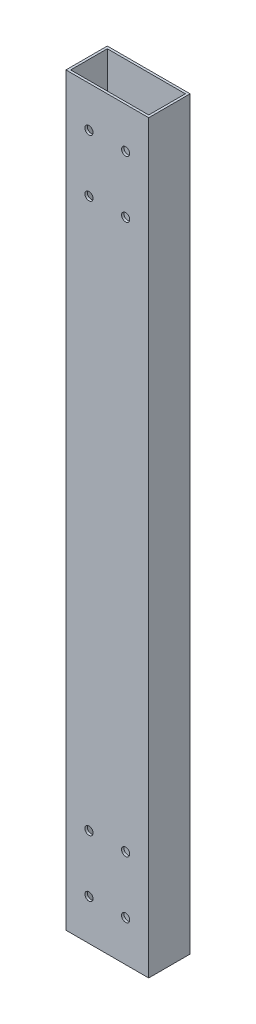
ISO-10303-21;
HEADER;
FILE_DESCRIPTION(('STEP AP214'),'2;1');
FILE_NAME('part.step','',(''),(''),'','','');
FILE_SCHEMA(('AUTOMOTIVE_DESIGN { 1 0 10303 214 1 1 1 1 }'));
ENDSEC;
DATA;
#1=APPLICATION_CONTEXT('core data for automotive mechanical design processes');
#2=APPLICATION_PROTOCOL_DEFINITION('international standard','automotive_design',2000,#1);
#3=PRODUCT_CONTEXT('',#1,'mechanical');
#4=PRODUCT('Part','Part','',(#3));
#5=PRODUCT_RELATED_PRODUCT_CATEGORY('part','',(#4));
#6=PRODUCT_DEFINITION_FORMATION('','',#4);
#7=PRODUCT_DEFINITION_CONTEXT('part definition',#1,'design');
#8=PRODUCT_DEFINITION('design','',#6,#7);
#9=PRODUCT_DEFINITION_SHAPE('','',#8);
#10=(LENGTH_UNIT() NAMED_UNIT(*) SI_UNIT(.MILLI.,.METRE.));
#11=(NAMED_UNIT(*) PLANE_ANGLE_UNIT() SI_UNIT($,.RADIAN.));
#12=(NAMED_UNIT(*) SI_UNIT($,.STERADIAN.) SOLID_ANGLE_UNIT());
#13=UNCERTAINTY_MEASURE_WITH_UNIT(LENGTH_MEASURE(1.E-05),#10,'distance_accuracy_value','');
#14=(GEOMETRIC_REPRESENTATION_CONTEXT(3) GLOBAL_UNCERTAINTY_ASSIGNED_CONTEXT((#13)) GLOBAL_UNIT_ASSIGNED_CONTEXT((#10,
#11,#12)) REPRESENTATION_CONTEXT('',''));
#15=CARTESIAN_POINT('',(0.,0.,0.));
#16=DIRECTION('',(0.,0.,1.));
#17=DIRECTION('',(1.,0.,0.));
#18=AXIS2_PLACEMENT_3D('',#15,#16,#17);
#19=CARTESIAN_POINT('',(0.,457.2,0.));
#20=DIRECTION('',(0.,-1.,0.));
#21=DIRECTION('',(0.,0.,-1.));
#22=AXIS2_PLACEMENT_3D('',#19,#20,#21);
#23=PLANE('',#22);
#24=DIRECTION('',(0.,0.,-1.));
#25=VECTOR('',#24,1.);
#26=CARTESIAN_POINT('',(25.4,457.2,12.7));
#27=LINE('',#26,#25);
#28=CARTESIAN_POINT('',(25.4,457.2,12.7));
#29=VERTEX_POINT('',#28);
#30=CARTESIAN_POINT('',(25.4,457.2,-12.7));
#31=VERTEX_POINT('',#30);
#32=EDGE_CURVE('E145',#29,#31,#27,.T.);
#33=ORIENTED_EDGE('',*,*,#32,.T.);
#34=DIRECTION('',(-1.,0.,0.));
#35=VECTOR('',#34,1.);
#36=CARTESIAN_POINT('',(-25.4,457.2,-12.7));
#37=LINE('',#36,#35);
#38=CARTESIAN_POINT('',(-25.4,457.2,-12.7));
#39=VERTEX_POINT('',#38);
#40=EDGE_CURVE('E150',#31,#39,#37,.T.);
#41=ORIENTED_EDGE('',*,*,#40,.T.);
#42=DIRECTION('',(0.,0.,1.));
#43=VECTOR('',#42,1.);
#44=CARTESIAN_POINT('',(-25.4,457.2,12.7));
#45=LINE('',#44,#43);
#46=CARTESIAN_POINT('',(-25.4,457.2,12.7));
#47=VERTEX_POINT('',#46);
#48=EDGE_CURVE('E147',#39,#47,#45,.T.);
#49=ORIENTED_EDGE('',*,*,#48,.T.);
#50=DIRECTION('',(1.,0.,0.));
#51=VECTOR('',#50,1.);
#52=CARTESIAN_POINT('',(-25.4,457.2,12.7));
#53=LINE('',#52,#51);
#54=EDGE_CURVE('E155',#47,#29,#53,.T.);
#55=ORIENTED_EDGE('',*,*,#54,.T.);
#56=EDGE_LOOP('',(#33,#41,#49,#55));
#57=FACE_BOUND('',#56,.T.);
#58=DIRECTION('',(0.,0.,1.));
#59=VECTOR('',#58,1.);
#60=CARTESIAN_POINT('',(-23.95,457.2,11.25));
#61=LINE('',#60,#59);
#62=CARTESIAN_POINT('',(-23.95,457.2,-11.25));
#63=VERTEX_POINT('',#62);
#64=CARTESIAN_POINT('',(-23.95,457.2,11.25));
#65=VERTEX_POINT('',#64);
#66=EDGE_CURVE('E106',#63,#65,#61,.T.);
#67=ORIENTED_EDGE('',*,*,#66,.F.);
#68=DIRECTION('',(-1.,0.,0.));
#69=VECTOR('',#68,1.);
#70=CARTESIAN_POINT('',(-23.95,457.2,-11.25));
#71=LINE('',#70,#69);
#72=CARTESIAN_POINT('',(23.95,457.2,-11.25));
#73=VERTEX_POINT('',#72);
#74=EDGE_CURVE('E126',#73,#63,#71,.T.);
#75=ORIENTED_EDGE('',*,*,#74,.F.);
#76=DIRECTION('',(0.,0.,-1.));
#77=VECTOR('',#76,1.);
#78=CARTESIAN_POINT('',(23.95,457.2,11.25));
#79=LINE('',#78,#77);
#80=CARTESIAN_POINT('',(23.95,457.2,11.25));
#81=VERTEX_POINT('',#80);
#82=EDGE_CURVE('E127',#81,#73,#79,.T.);
#83=ORIENTED_EDGE('',*,*,#82,.F.);
#84=DIRECTION('',(1.,0.,0.));
#85=VECTOR('',#84,1.);
#86=CARTESIAN_POINT('',(-23.95,457.2,11.25));
#87=LINE('',#86,#85);
#88=EDGE_CURVE('E111',#65,#81,#87,.T.);
#89=ORIENTED_EDGE('',*,*,#88,.F.);
#90=EDGE_LOOP('',(#67,#75,#83,#89));
#91=FACE_BOUND('',#90,.T.);
#92=ADVANCED_FACE('F39',(#57,#91),#23,.F.);
#93=CARTESIAN_POINT('',(0.,0.,0.));
#94=DIRECTION('',(0.,-1.,0.));
#95=DIRECTION('',(0.,0.,-1.));
#96=AXIS2_PLACEMENT_3D('',#93,#94,#95);
#97=PLANE('',#96);
#98=DIRECTION('',(0.,0.,-1.));
#99=VECTOR('',#98,1.);
#100=CARTESIAN_POINT('',(25.4,0.,12.7));
#101=LINE('',#100,#99);
#102=CARTESIAN_POINT('',(25.4,0.,12.7));
#103=VERTEX_POINT('',#102);
#104=CARTESIAN_POINT('',(25.4,0.,-12.7));
#105=VERTEX_POINT('',#104);
#106=EDGE_CURVE('E125',#103,#105,#101,.T.);
#107=ORIENTED_EDGE('',*,*,#106,.F.);
#108=DIRECTION('',(1.,0.,0.));
#109=VECTOR('',#108,1.);
#110=CARTESIAN_POINT('',(-25.4,0.,12.7));
#111=LINE('',#110,#109);
#112=CARTESIAN_POINT('',(-25.4,0.,12.7));
#113=VERTEX_POINT('',#112);
#114=EDGE_CURVE('E146',#113,#103,#111,.T.);
#115=ORIENTED_EDGE('',*,*,#114,.F.);
#116=DIRECTION('',(0.,0.,1.));
#117=VECTOR('',#116,1.);
#118=CARTESIAN_POINT('',(-25.4,0.,12.7));
#119=LINE('',#118,#117);
#120=CARTESIAN_POINT('',(-25.4,0.,-12.7));
#121=VERTEX_POINT('',#120);
#122=EDGE_CURVE('E157',#121,#113,#119,.T.);
#123=ORIENTED_EDGE('',*,*,#122,.F.);
#124=DIRECTION('',(-1.,0.,0.));
#125=VECTOR('',#124,1.);
#126=CARTESIAN_POINT('',(-25.4,0.,-12.7));
#127=LINE('',#126,#125);
#128=EDGE_CURVE('E160',#105,#121,#127,.T.);
#129=ORIENTED_EDGE('',*,*,#128,.F.);
#130=EDGE_LOOP('',(#107,#115,#123,#129));
#131=FACE_BOUND('',#130,.T.);
#132=DIRECTION('',(-1.,0.,0.));
#133=VECTOR('',#132,1.);
#134=CARTESIAN_POINT('',(-23.95,0.,-11.25));
#135=LINE('',#134,#133);
#136=CARTESIAN_POINT('',(23.95,0.,-11.25));
#137=VERTEX_POINT('',#136);
#138=CARTESIAN_POINT('',(-23.95,0.,-11.25));
#139=VERTEX_POINT('',#138);
#140=EDGE_CURVE('E113',#137,#139,#135,.T.);
#141=ORIENTED_EDGE('',*,*,#140,.T.);
#142=DIRECTION('',(0.,0.,1.));
#143=VECTOR('',#142,1.);
#144=CARTESIAN_POINT('',(-23.95,0.,11.25));
#145=LINE('',#144,#143);
#146=CARTESIAN_POINT('',(-23.95,0.,11.25));
#147=VERTEX_POINT('',#146);
#148=EDGE_CURVE('E64',#139,#147,#145,.T.);
#149=ORIENTED_EDGE('',*,*,#148,.T.);
#150=DIRECTION('',(1.,0.,0.));
#151=VECTOR('',#150,1.);
#152=CARTESIAN_POINT('',(-23.95,0.,11.25));
#153=LINE('',#152,#151);
#154=CARTESIAN_POINT('',(23.95,0.,11.25));
#155=VERTEX_POINT('',#154);
#156=EDGE_CURVE('E123',#147,#155,#153,.T.);
#157=ORIENTED_EDGE('',*,*,#156,.T.);
#158=DIRECTION('',(0.,0.,-1.));
#159=VECTOR('',#158,1.);
#160=CARTESIAN_POINT('',(23.95,0.,11.25));
#161=LINE('',#160,#159);
#162=EDGE_CURVE('E138',#155,#137,#161,.T.);
#163=ORIENTED_EDGE('',*,*,#162,.T.);
#164=EDGE_LOOP('',(#141,#149,#157,#163));
#165=FACE_BOUND('',#164,.T.);
#166=ADVANCED_FACE('F278',(#131,#165),#97,.T.);
#167=CARTESIAN_POINT('',(25.4,457.2,12.7));
#168=DIRECTION('',(-1.,0.,0.));
#169=DIRECTION('',(0.,0.,1.));
#170=AXIS2_PLACEMENT_3D('',#167,#168,#169);
#171=PLANE('',#170);
#172=ORIENTED_EDGE('',*,*,#106,.T.);
#173=DIRECTION('',(0.,-1.,0.));
#174=VECTOR('',#173,1.);
#175=CARTESIAN_POINT('',(25.4,457.2,-12.7));
#176=LINE('',#175,#174);
#177=EDGE_CURVE('E11',#31,#105,#176,.T.);
#178=ORIENTED_EDGE('',*,*,#177,.F.);
#179=ORIENTED_EDGE('',*,*,#32,.F.);
#180=DIRECTION('',(0.,-1.,0.));
#181=VECTOR('',#180,1.);
#182=CARTESIAN_POINT('',(25.4,457.2,12.7));
#183=LINE('',#182,#181);
#184=EDGE_CURVE('E152',#29,#103,#183,.T.);
#185=ORIENTED_EDGE('',*,*,#184,.T.);
#186=EDGE_LOOP('',(#172,#178,#179,#185));
#187=FACE_BOUND('',#186,.T.);
#188=ADVANCED_FACE('F41',(#187),#171,.F.);
#189=CARTESIAN_POINT('',(-25.4,457.2,-12.7));
#190=DIRECTION('',(0.,0.,1.));
#191=DIRECTION('',(1.,0.,0.));
#192=AXIS2_PLACEMENT_3D('',#189,#190,#191);
#193=PLANE('',#192);
#194=CARTESIAN_POINT('',(11.25,432.2,-12.7));
#195=DIRECTION('',(0.,0.,-1.));
#196=DIRECTION('',(1.,0.,0.));
#197=AXIS2_PLACEMENT_3D('',#194,#195,#196);
#198=CIRCLE('',#197,2.5);
#199=CARTESIAN_POINT('',(13.75,432.2,-12.7));
#200=VERTEX_POINT('',#199);
#201=EDGE_CURVE('E373',#200,#200,#198,.T.);
#202=ORIENTED_EDGE('',*,*,#201,.F.);
#203=EDGE_LOOP('',(#202));
#204=FACE_BOUND('',#203,.T.);
#205=CARTESIAN_POINT('',(-11.25,432.2,-12.7));
#206=DIRECTION('',(0.,0.,-1.));
#207=DIRECTION('',(1.,0.,0.));
#208=AXIS2_PLACEMENT_3D('',#205,#206,#207);
#209=CIRCLE('',#208,2.5);
#210=CARTESIAN_POINT('',(-8.75,432.2,-12.7));
#211=VERTEX_POINT('',#210);
#212=EDGE_CURVE('E362',#211,#211,#209,.T.);
#213=ORIENTED_EDGE('',*,*,#212,.F.);
#214=EDGE_LOOP('',(#213));
#215=FACE_BOUND('',#214,.T.);
#216=CARTESIAN_POINT('',(-11.25,397.2,-12.7));
#217=DIRECTION('',(0.,0.,-1.));
#218=DIRECTION('',(1.,0.,0.));
#219=AXIS2_PLACEMENT_3D('',#216,#217,#218);
#220=CIRCLE('',#219,2.5);
#221=CARTESIAN_POINT('',(-8.75,397.2,-12.7));
#222=VERTEX_POINT('',#221);
#223=EDGE_CURVE('E363',#222,#222,#220,.T.);
#224=ORIENTED_EDGE('',*,*,#223,.F.);
#225=EDGE_LOOP('',(#224));
#226=FACE_BOUND('',#225,.T.);
#227=CARTESIAN_POINT('',(11.25,397.2,-12.7));
#228=DIRECTION('',(0.,0.,-1.));
#229=DIRECTION('',(1.,0.,0.));
#230=AXIS2_PLACEMENT_3D('',#227,#228,#229);
#231=CIRCLE('',#230,2.5);
#232=CARTESIAN_POINT('',(13.75,397.2,-12.7));
#233=VERTEX_POINT('',#232);
#234=EDGE_CURVE('E189',#233,#233,#231,.T.);
#235=ORIENTED_EDGE('',*,*,#234,.F.);
#236=EDGE_LOOP('',(#235));
#237=FACE_BOUND('',#236,.T.);
#238=CARTESIAN_POINT('',(11.25,25.,-12.7));
#239=DIRECTION('',(0.,0.,1.));
#240=DIRECTION('',(1.,0.,0.));
#241=AXIS2_PLACEMENT_3D('',#238,#239,#240);
#242=CIRCLE('',#241,2.5);
#243=CARTESIAN_POINT('',(13.75,25.,-12.7));
#244=VERTEX_POINT('',#243);
#245=EDGE_CURVE('E209',#244,#244,#242,.T.);
#246=ORIENTED_EDGE('',*,*,#245,.T.);
#247=EDGE_LOOP('',(#246));
#248=FACE_BOUND('',#247,.T.);
#249=CARTESIAN_POINT('',(-11.25,25.,-12.7));
#250=DIRECTION('',(0.,0.,1.));
#251=DIRECTION('',(1.,0.,0.));
#252=AXIS2_PLACEMENT_3D('',#249,#250,#251);
#253=CIRCLE('',#252,2.5);
#254=CARTESIAN_POINT('',(-8.75,25.,-12.7));
#255=VERTEX_POINT('',#254);
#256=EDGE_CURVE('E222',#255,#255,#253,.T.);
#257=ORIENTED_EDGE('',*,*,#256,.T.);
#258=EDGE_LOOP('',(#257));
#259=FACE_BOUND('',#258,.T.);
#260=CARTESIAN_POINT('',(-11.25,60.,-12.7));
#261=DIRECTION('',(0.,0.,1.));
#262=DIRECTION('',(1.,0.,0.));
#263=AXIS2_PLACEMENT_3D('',#260,#261,#262);
#264=CIRCLE('',#263,2.5);
#265=CARTESIAN_POINT('',(-8.75,60.,-12.7));
#266=VERTEX_POINT('',#265);
#267=EDGE_CURVE('E214',#266,#266,#264,.T.);
#268=ORIENTED_EDGE('',*,*,#267,.T.);
#269=EDGE_LOOP('',(#268));
#270=FACE_BOUND('',#269,.T.);
#271=CARTESIAN_POINT('',(11.25,60.,-12.7));
#272=DIRECTION('',(0.,0.,1.));
#273=DIRECTION('',(1.,0.,0.));
#274=AXIS2_PLACEMENT_3D('',#271,#272,#273);
#275=CIRCLE('',#274,2.5);
#276=CARTESIAN_POINT('',(13.75,60.,-12.7));
#277=VERTEX_POINT('',#276);
#278=EDGE_CURVE('E173',#277,#277,#275,.T.);
#279=ORIENTED_EDGE('',*,*,#278,.T.);
#280=EDGE_LOOP('',(#279));
#281=FACE_BOUND('',#280,.T.);
#282=ORIENTED_EDGE('',*,*,#128,.T.);
#283=DIRECTION('',(0.,-1.,0.));
#284=VECTOR('',#283,1.);
#285=CARTESIAN_POINT('',(-25.4,457.2,-12.7));
#286=LINE('',#285,#284);
#287=EDGE_CURVE('E48',#39,#121,#286,.T.);
#288=ORIENTED_EDGE('',*,*,#287,.F.);
#289=ORIENTED_EDGE('',*,*,#40,.F.);
#290=ORIENTED_EDGE('',*,*,#177,.T.);
#291=EDGE_LOOP('',(#282,#288,#289,#290));
#292=FACE_BOUND('',#291,.T.);
#293=ADVANCED_FACE('F284',(#204,#215,#226,#237,#248,#259,#270,#281,#292),#193,.F.);
#294=CARTESIAN_POINT('',(-25.4,457.2,12.7));
#295=DIRECTION('',(1.,0.,0.));
#296=DIRECTION('',(0.,0.,-1.));
#297=AXIS2_PLACEMENT_3D('',#294,#295,#296);
#298=PLANE('',#297);
#299=ORIENTED_EDGE('',*,*,#122,.T.);
#300=DIRECTION('',(0.,-1.,0.));
#301=VECTOR('',#300,1.);
#302=CARTESIAN_POINT('',(-25.4,457.2,12.7));
#303=LINE('',#302,#301);
#304=EDGE_CURVE('E163',#47,#113,#303,.T.);
#305=ORIENTED_EDGE('',*,*,#304,.F.);
#306=ORIENTED_EDGE('',*,*,#48,.F.);
#307=ORIENTED_EDGE('',*,*,#287,.T.);
#308=EDGE_LOOP('',(#299,#305,#306,#307));
#309=FACE_BOUND('',#308,.T.);
#310=ADVANCED_FACE('F270',(#309),#298,.F.);
#311=CARTESIAN_POINT('',(-25.4,457.2,12.7));
#312=DIRECTION('',(0.,0.,-1.));
#313=DIRECTION('',(-1.,0.,0.));
#314=AXIS2_PLACEMENT_3D('',#311,#312,#313);
#315=PLANE('',#314);
#316=CARTESIAN_POINT('',(11.25,432.2,12.7));
#317=DIRECTION('',(0.,0.,-1.));
#318=DIRECTION('',(1.,0.,0.));
#319=AXIS2_PLACEMENT_3D('',#316,#317,#318);
#320=CIRCLE('',#319,2.5);
#321=CARTESIAN_POINT('',(13.75,432.2,12.7));
#322=VERTEX_POINT('',#321);
#323=EDGE_CURVE('E376',#322,#322,#320,.T.);
#324=ORIENTED_EDGE('',*,*,#323,.T.);
#325=EDGE_LOOP('',(#324));
#326=FACE_BOUND('',#325,.T.);
#327=CARTESIAN_POINT('',(-11.25,432.2,12.7));
#328=DIRECTION('',(0.,0.,-1.));
#329=DIRECTION('',(1.,0.,0.));
#330=AXIS2_PLACEMENT_3D('',#327,#328,#329);
#331=CIRCLE('',#330,2.5);
#332=CARTESIAN_POINT('',(-8.75,432.2,12.7));
#333=VERTEX_POINT('',#332);
#334=EDGE_CURVE('E366',#333,#333,#331,.T.);
#335=ORIENTED_EDGE('',*,*,#334,.T.);
#336=EDGE_LOOP('',(#335));
#337=FACE_BOUND('',#336,.T.);
#338=CARTESIAN_POINT('',(-11.25,397.2,12.7));
#339=DIRECTION('',(0.,0.,-1.));
#340=DIRECTION('',(1.,0.,0.));
#341=AXIS2_PLACEMENT_3D('',#338,#339,#340);
#342=CIRCLE('',#341,2.5);
#343=CARTESIAN_POINT('',(-8.75,397.2,12.7));
#344=VERTEX_POINT('',#343);
#345=EDGE_CURVE('E357',#344,#344,#342,.T.);
#346=ORIENTED_EDGE('',*,*,#345,.T.);
#347=EDGE_LOOP('',(#346));
#348=FACE_BOUND('',#347,.T.);
#349=CARTESIAN_POINT('',(11.25,397.2,12.7));
#350=DIRECTION('',(0.,0.,-1.));
#351=DIRECTION('',(1.,0.,0.));
#352=AXIS2_PLACEMENT_3D('',#349,#350,#351);
#353=CIRCLE('',#352,2.5);
#354=CARTESIAN_POINT('',(13.75,397.2,12.7));
#355=VERTEX_POINT('',#354);
#356=EDGE_CURVE('E364',#355,#355,#353,.T.);
#357=ORIENTED_EDGE('',*,*,#356,.T.);
#358=EDGE_LOOP('',(#357));
#359=FACE_BOUND('',#358,.T.);
#360=CARTESIAN_POINT('',(11.25,25.,12.7));
#361=DIRECTION('',(0.,0.,1.));
#362=DIRECTION('',(1.,0.,0.));
#363=AXIS2_PLACEMENT_3D('',#360,#361,#362);
#364=CIRCLE('',#363,2.5);
#365=CARTESIAN_POINT('',(13.75,25.,12.7));
#366=VERTEX_POINT('',#365);
#367=EDGE_CURVE('E221',#366,#366,#364,.T.);
#368=ORIENTED_EDGE('',*,*,#367,.F.);
#369=EDGE_LOOP('',(#368));
#370=FACE_BOUND('',#369,.T.);
#371=CARTESIAN_POINT('',(-11.25,25.,12.7));
#372=DIRECTION('',(0.,0.,1.));
#373=DIRECTION('',(1.,0.,0.));
#374=AXIS2_PLACEMENT_3D('',#371,#372,#373);
#375=CIRCLE('',#374,2.5);
#376=CARTESIAN_POINT('',(-8.75,25.,12.7));
#377=VERTEX_POINT('',#376);
#378=EDGE_CURVE('E217',#377,#377,#375,.T.);
#379=ORIENTED_EDGE('',*,*,#378,.F.);
#380=EDGE_LOOP('',(#379));
#381=FACE_BOUND('',#380,.T.);
#382=CARTESIAN_POINT('',(-11.25,60.,12.7));
#383=DIRECTION('',(0.,0.,1.));
#384=DIRECTION('',(1.,0.,0.));
#385=AXIS2_PLACEMENT_3D('',#382,#383,#384);
#386=CIRCLE('',#385,2.5);
#387=CARTESIAN_POINT('',(-8.75,60.,12.7));
#388=VERTEX_POINT('',#387);
#389=EDGE_CURVE('E211',#388,#388,#386,.T.);
#390=ORIENTED_EDGE('',*,*,#389,.F.);
#391=EDGE_LOOP('',(#390));
#392=FACE_BOUND('',#391,.T.);
#393=CARTESIAN_POINT('',(11.25,60.,12.7));
#394=DIRECTION('',(0.,0.,1.));
#395=DIRECTION('',(1.,0.,0.));
#396=AXIS2_PLACEMENT_3D('',#393,#394,#395);
#397=CIRCLE('',#396,2.5);
#398=CARTESIAN_POINT('',(13.75,60.,12.7));
#399=VERTEX_POINT('',#398);
#400=EDGE_CURVE('E212',#399,#399,#397,.T.);
#401=ORIENTED_EDGE('',*,*,#400,.F.);
#402=EDGE_LOOP('',(#401));
#403=FACE_BOUND('',#402,.T.);
#404=ORIENTED_EDGE('',*,*,#114,.T.);
#405=ORIENTED_EDGE('',*,*,#184,.F.);
#406=ORIENTED_EDGE('',*,*,#54,.F.);
#407=ORIENTED_EDGE('',*,*,#304,.T.);
#408=EDGE_LOOP('',(#404,#405,#406,#407));
#409=FACE_BOUND('',#408,.T.);
#410=ADVANCED_FACE('F262',(#326,#337,#348,#359,#370,#381,#392,#403,#409),#315,.F.);
#411=CARTESIAN_POINT('',(-23.95,457.2,11.25));
#412=DIRECTION('',(1.,0.,0.));
#413=DIRECTION('',(0.,0.,-1.));
#414=AXIS2_PLACEMENT_3D('',#411,#412,#413);
#415=PLANE('',#414);
#416=ORIENTED_EDGE('',*,*,#148,.F.);
#417=DIRECTION('',(0.,-1.,0.));
#418=VECTOR('',#417,1.);
#419=CARTESIAN_POINT('',(-23.95,457.2,-11.25));
#420=LINE('',#419,#418);
#421=EDGE_CURVE('E109',#63,#139,#420,.T.);
#422=ORIENTED_EDGE('',*,*,#421,.F.);
#423=ORIENTED_EDGE('',*,*,#66,.T.);
#424=DIRECTION('',(0.,-1.,0.));
#425=VECTOR('',#424,1.);
#426=CARTESIAN_POINT('',(-23.95,457.2,11.25));
#427=LINE('',#426,#425);
#428=EDGE_CURVE('E108',#65,#147,#427,.T.);
#429=ORIENTED_EDGE('',*,*,#428,.T.);
#430=EDGE_LOOP('',(#416,#422,#423,#429));
#431=FACE_BOUND('',#430,.T.);
#432=ADVANCED_FACE('F107',(#431),#415,.T.);
#433=CARTESIAN_POINT('',(-23.95,457.2,11.25));
#434=DIRECTION('',(0.,0.,-1.));
#435=DIRECTION('',(-1.,0.,0.));
#436=AXIS2_PLACEMENT_3D('',#433,#434,#435);
#437=PLANE('',#436);
#438=CARTESIAN_POINT('',(11.25,432.2,11.25));
#439=DIRECTION('',(0.,0.,-1.));
#440=DIRECTION('',(-1.,0.,0.));
#441=AXIS2_PLACEMENT_3D('',#438,#439,#440);
#442=CIRCLE('',#441,2.5);
#443=CARTESIAN_POINT('',(8.75,432.2,11.25));
#444=VERTEX_POINT('',#443);
#445=EDGE_CURVE('E210',#444,#444,#442,.F.);
#446=ORIENTED_EDGE('',*,*,#445,.T.);
#447=EDGE_LOOP('',(#446));
#448=FACE_BOUND('',#447,.T.);
#449=CARTESIAN_POINT('',(-11.25,432.2,11.25));
#450=DIRECTION('',(0.,0.,-1.));
#451=DIRECTION('',(-1.,0.,0.));
#452=AXIS2_PLACEMENT_3D('',#449,#450,#451);
#453=CIRCLE('',#452,2.5);
#454=CARTESIAN_POINT('',(-13.75,432.2,11.25));
#455=VERTEX_POINT('',#454);
#456=EDGE_CURVE('E194',#455,#455,#453,.F.);
#457=ORIENTED_EDGE('',*,*,#456,.T.);
#458=EDGE_LOOP('',(#457));
#459=FACE_BOUND('',#458,.T.);
#460=CARTESIAN_POINT('',(-11.25,397.2,11.25));
#461=DIRECTION('',(0.,0.,-1.));
#462=DIRECTION('',(-1.,0.,0.));
#463=AXIS2_PLACEMENT_3D('',#460,#461,#462);
#464=CIRCLE('',#463,2.5);
#465=CARTESIAN_POINT('',(-13.75,397.2,11.25));
#466=VERTEX_POINT('',#465);
#467=EDGE_CURVE('E195',#466,#466,#464,.F.);
#468=ORIENTED_EDGE('',*,*,#467,.T.);
#469=EDGE_LOOP('',(#468));
#470=FACE_BOUND('',#469,.T.);
#471=CARTESIAN_POINT('',(11.25,397.2,11.25));
#472=DIRECTION('',(0.,0.,-1.));
#473=DIRECTION('',(-1.,0.,0.));
#474=AXIS2_PLACEMENT_3D('',#471,#472,#473);
#475=CIRCLE('',#474,2.5);
#476=CARTESIAN_POINT('',(8.75,397.2,11.25));
#477=VERTEX_POINT('',#476);
#478=EDGE_CURVE('E188',#477,#477,#475,.F.);
#479=ORIENTED_EDGE('',*,*,#478,.T.);
#480=EDGE_LOOP('',(#479));
#481=FACE_BOUND('',#480,.T.);
#482=CARTESIAN_POINT('',(11.25,25.,11.25));
#483=DIRECTION('',(0.,0.,-1.));
#484=DIRECTION('',(-1.,0.,0.));
#485=AXIS2_PLACEMENT_3D('',#482,#483,#484);
#486=CIRCLE('',#485,2.5);
#487=CARTESIAN_POINT('',(8.75,25.,11.25));
#488=VERTEX_POINT('',#487);
#489=EDGE_CURVE('E134',#488,#488,#486,.T.);
#490=ORIENTED_EDGE('',*,*,#489,.F.);
#491=EDGE_LOOP('',(#490));
#492=FACE_BOUND('',#491,.T.);
#493=CARTESIAN_POINT('',(-11.25,25.,11.25));
#494=DIRECTION('',(0.,0.,-1.));
#495=DIRECTION('',(-1.,0.,0.));
#496=AXIS2_PLACEMENT_3D('',#493,#494,#495);
#497=CIRCLE('',#496,2.5);
#498=CARTESIAN_POINT('',(-13.75,25.,11.25));
#499=VERTEX_POINT('',#498);
#500=EDGE_CURVE('E182',#499,#499,#497,.T.);
#501=ORIENTED_EDGE('',*,*,#500,.F.);
#502=EDGE_LOOP('',(#501));
#503=FACE_BOUND('',#502,.T.);
#504=CARTESIAN_POINT('',(-11.25,60.,11.25));
#505=DIRECTION('',(0.,0.,-1.));
#506=DIRECTION('',(-1.,0.,0.));
#507=AXIS2_PLACEMENT_3D('',#504,#505,#506);
#508=CIRCLE('',#507,2.5);
#509=CARTESIAN_POINT('',(-13.75,60.,11.25));
#510=VERTEX_POINT('',#509);
#511=EDGE_CURVE('E180',#510,#510,#508,.T.);
#512=ORIENTED_EDGE('',*,*,#511,.F.);
#513=EDGE_LOOP('',(#512));
#514=FACE_BOUND('',#513,.T.);
#515=CARTESIAN_POINT('',(11.25,60.,11.25));
#516=DIRECTION('',(0.,0.,-1.));
#517=DIRECTION('',(-1.,0.,0.));
#518=AXIS2_PLACEMENT_3D('',#515,#516,#517);
#519=CIRCLE('',#518,2.5);
#520=CARTESIAN_POINT('',(8.75,60.,11.25));
#521=VERTEX_POINT('',#520);
#522=EDGE_CURVE('E175',#521,#521,#519,.T.);
#523=ORIENTED_EDGE('',*,*,#522,.F.);
#524=EDGE_LOOP('',(#523));
#525=FACE_BOUND('',#524,.T.);
#526=ORIENTED_EDGE('',*,*,#156,.F.);
#527=ORIENTED_EDGE('',*,*,#428,.F.);
#528=ORIENTED_EDGE('',*,*,#88,.T.);
#529=DIRECTION('',(0.,-1.,0.));
#530=VECTOR('',#529,1.);
#531=CARTESIAN_POINT('',(23.95,457.2,11.25));
#532=LINE('',#531,#530);
#533=EDGE_CURVE('E121',#81,#155,#532,.T.);
#534=ORIENTED_EDGE('',*,*,#533,.T.);
#535=EDGE_LOOP('',(#526,#527,#528,#534));
#536=FACE_BOUND('',#535,.T.);
#537=ADVANCED_FACE('F118',(#448,#459,#470,#481,#492,#503,#514,#525,#536),#437,.T.);
#538=CARTESIAN_POINT('',(23.95,457.2,11.25));
#539=DIRECTION('',(-1.,0.,0.));
#540=DIRECTION('',(0.,0.,1.));
#541=AXIS2_PLACEMENT_3D('',#538,#539,#540);
#542=PLANE('',#541);
#543=ORIENTED_EDGE('',*,*,#162,.F.);
#544=ORIENTED_EDGE('',*,*,#533,.F.);
#545=ORIENTED_EDGE('',*,*,#82,.T.);
#546=DIRECTION('',(0.,-1.,0.));
#547=VECTOR('',#546,1.);
#548=CARTESIAN_POINT('',(23.95,457.2,-11.25));
#549=LINE('',#548,#547);
#550=EDGE_CURVE('E57',#73,#137,#549,.T.);
#551=ORIENTED_EDGE('',*,*,#550,.T.);
#552=EDGE_LOOP('',(#543,#544,#545,#551));
#553=FACE_BOUND('',#552,.T.);
#554=ADVANCED_FACE('F248',(#553),#542,.T.);
#555=CARTESIAN_POINT('',(-23.95,457.2,-11.25));
#556=DIRECTION('',(0.,0.,1.));
#557=DIRECTION('',(1.,0.,0.));
#558=AXIS2_PLACEMENT_3D('',#555,#556,#557);
#559=PLANE('',#558);
#560=CARTESIAN_POINT('',(11.25,432.2,-11.25));
#561=DIRECTION('',(0.,0.,1.));
#562=DIRECTION('',(1.,0.,0.));
#563=AXIS2_PLACEMENT_3D('',#560,#561,#562);
#564=CIRCLE('',#563,2.5);
#565=CARTESIAN_POINT('',(13.75,432.2,-11.25));
#566=VERTEX_POINT('',#565);
#567=EDGE_CURVE('E43',#566,#566,#564,.F.);
#568=ORIENTED_EDGE('',*,*,#567,.T.);
#569=EDGE_LOOP('',(#568));
#570=FACE_BOUND('',#569,.T.);
#571=CARTESIAN_POINT('',(-11.25,432.2,-11.25));
#572=DIRECTION('',(0.,0.,1.));
#573=DIRECTION('',(1.,0.,0.));
#574=AXIS2_PLACEMENT_3D('',#571,#572,#573);
#575=CIRCLE('',#574,2.5);
#576=CARTESIAN_POINT('',(-8.75,432.2,-11.25));
#577=VERTEX_POINT('',#576);
#578=EDGE_CURVE('E191',#577,#577,#575,.F.);
#579=ORIENTED_EDGE('',*,*,#578,.T.);
#580=EDGE_LOOP('',(#579));
#581=FACE_BOUND('',#580,.T.);
#582=CARTESIAN_POINT('',(-11.25,397.2,-11.25));
#583=DIRECTION('',(0.,0.,1.));
#584=DIRECTION('',(1.,0.,0.));
#585=AXIS2_PLACEMENT_3D('',#582,#583,#584);
#586=CIRCLE('',#585,2.5);
#587=CARTESIAN_POINT('',(-8.75,397.2,-11.25));
#588=VERTEX_POINT('',#587);
#589=EDGE_CURVE('E186',#588,#588,#586,.F.);
#590=ORIENTED_EDGE('',*,*,#589,.T.);
#591=EDGE_LOOP('',(#590));
#592=FACE_BOUND('',#591,.T.);
#593=CARTESIAN_POINT('',(11.25,397.2,-11.25));
#594=DIRECTION('',(0.,0.,1.));
#595=DIRECTION('',(1.,0.,0.));
#596=AXIS2_PLACEMENT_3D('',#593,#594,#595);
#597=CIRCLE('',#596,2.5);
#598=CARTESIAN_POINT('',(13.75,397.2,-11.25));
#599=VERTEX_POINT('',#598);
#600=EDGE_CURVE('E183',#599,#599,#597,.F.);
#601=ORIENTED_EDGE('',*,*,#600,.T.);
#602=EDGE_LOOP('',(#601));
#603=FACE_BOUND('',#602,.T.);
#604=CARTESIAN_POINT('',(11.25,25.,-11.25));
#605=DIRECTION('',(0.,0.,1.));
#606=DIRECTION('',(1.,0.,0.));
#607=AXIS2_PLACEMENT_3D('',#604,#605,#606);
#608=CIRCLE('',#607,2.5);
#609=CARTESIAN_POINT('',(13.75,25.,-11.25));
#610=VERTEX_POINT('',#609);
#611=EDGE_CURVE('E185',#610,#610,#608,.T.);
#612=ORIENTED_EDGE('',*,*,#611,.F.);
#613=EDGE_LOOP('',(#612));
#614=FACE_BOUND('',#613,.T.);
#615=CARTESIAN_POINT('',(-11.25,25.,-11.25));
#616=DIRECTION('',(0.,0.,1.));
#617=DIRECTION('',(1.,0.,0.));
#618=AXIS2_PLACEMENT_3D('',#615,#616,#617);
#619=CIRCLE('',#618,2.5);
#620=CARTESIAN_POINT('',(-8.75,25.,-11.25));
#621=VERTEX_POINT('',#620);
#622=EDGE_CURVE('E176',#621,#621,#619,.T.);
#623=ORIENTED_EDGE('',*,*,#622,.F.);
#624=EDGE_LOOP('',(#623));
#625=FACE_BOUND('',#624,.T.);
#626=CARTESIAN_POINT('',(-11.25,60.,-11.25));
#627=DIRECTION('',(0.,0.,1.));
#628=DIRECTION('',(1.,0.,0.));
#629=AXIS2_PLACEMENT_3D('',#626,#627,#628);
#630=CIRCLE('',#629,2.5);
#631=CARTESIAN_POINT('',(-8.75,60.,-11.25));
#632=VERTEX_POINT('',#631);
#633=EDGE_CURVE('E174',#632,#632,#630,.T.);
#634=ORIENTED_EDGE('',*,*,#633,.F.);
#635=EDGE_LOOP('',(#634));
#636=FACE_BOUND('',#635,.T.);
#637=CARTESIAN_POINT('',(11.25,60.,-11.25));
#638=DIRECTION('',(0.,0.,1.));
#639=DIRECTION('',(1.,0.,0.));
#640=AXIS2_PLACEMENT_3D('',#637,#638,#639);
#641=CIRCLE('',#640,2.5);
#642=CARTESIAN_POINT('',(13.75,60.,-11.25));
#643=VERTEX_POINT('',#642);
#644=EDGE_CURVE('E166',#643,#643,#641,.T.);
#645=ORIENTED_EDGE('',*,*,#644,.F.);
#646=EDGE_LOOP('',(#645));
#647=FACE_BOUND('',#646,.T.);
#648=ORIENTED_EDGE('',*,*,#140,.F.);
#649=ORIENTED_EDGE('',*,*,#550,.F.);
#650=ORIENTED_EDGE('',*,*,#74,.T.);
#651=ORIENTED_EDGE('',*,*,#421,.T.);
#652=EDGE_LOOP('',(#648,#649,#650,#651));
#653=FACE_BOUND('',#652,.T.);
#654=ADVANCED_FACE('F308',(#570,#581,#592,#603,#614,#625,#636,#647,#653),#559,.T.);
#655=CARTESIAN_POINT('',(11.25,60.,-12.7));
#656=DIRECTION('',(0.,0.,1.));
#657=DIRECTION('',(1.,0.,0.));
#658=AXIS2_PLACEMENT_3D('',#655,#656,#657);
#659=CYLINDRICAL_SURFACE('',#658,2.5);
#660=ORIENTED_EDGE('',*,*,#644,.T.);
#661=EDGE_LOOP('',(#660));
#662=FACE_BOUND('',#661,.T.);
#663=ORIENTED_EDGE('',*,*,#278,.F.);
#664=EDGE_LOOP('',(#663));
#665=FACE_BOUND('',#664,.T.);
#666=ADVANCED_FACE('F261',(#662,#665),#659,.F.);
#667=CARTESIAN_POINT('',(-11.25,60.,-12.7));
#668=DIRECTION('',(0.,0.,1.));
#669=DIRECTION('',(1.,0.,0.));
#670=AXIS2_PLACEMENT_3D('',#667,#668,#669);
#671=CYLINDRICAL_SURFACE('',#670,2.5);
#672=ORIENTED_EDGE('',*,*,#633,.T.);
#673=EDGE_LOOP('',(#672));
#674=FACE_BOUND('',#673,.T.);
#675=ORIENTED_EDGE('',*,*,#267,.F.);
#676=EDGE_LOOP('',(#675));
#677=FACE_BOUND('',#676,.T.);
#678=ADVANCED_FACE('F315',(#674,#677),#671,.F.);
#679=CARTESIAN_POINT('',(-11.25,25.,-12.7));
#680=DIRECTION('',(0.,0.,1.));
#681=DIRECTION('',(1.,0.,0.));
#682=AXIS2_PLACEMENT_3D('',#679,#680,#681);
#683=CYLINDRICAL_SURFACE('',#682,2.5);
#684=ORIENTED_EDGE('',*,*,#622,.T.);
#685=EDGE_LOOP('',(#684));
#686=FACE_BOUND('',#685,.T.);
#687=ORIENTED_EDGE('',*,*,#256,.F.);
#688=EDGE_LOOP('',(#687));
#689=FACE_BOUND('',#688,.T.);
#690=ADVANCED_FACE('F316',(#686,#689),#683,.F.);
#691=CARTESIAN_POINT('',(11.25,25.,-12.7));
#692=DIRECTION('',(0.,0.,1.));
#693=DIRECTION('',(1.,0.,0.));
#694=AXIS2_PLACEMENT_3D('',#691,#692,#693);
#695=CYLINDRICAL_SURFACE('',#694,2.5);
#696=ORIENTED_EDGE('',*,*,#611,.T.);
#697=EDGE_LOOP('',(#696));
#698=FACE_BOUND('',#697,.T.);
#699=ORIENTED_EDGE('',*,*,#245,.F.);
#700=EDGE_LOOP('',(#699));
#701=FACE_BOUND('',#700,.T.);
#702=ADVANCED_FACE('F259',(#698,#701),#695,.F.);
#703=ORIENTED_EDGE('',*,*,#522,.T.);
#704=EDGE_LOOP('',(#703));
#705=FACE_BOUND('',#704,.T.);
#706=ORIENTED_EDGE('',*,*,#400,.T.);
#707=EDGE_LOOP('',(#706));
#708=FACE_BOUND('',#707,.T.);
#709=ADVANCED_FACE('F254',(#705,#708),#659,.F.);
#710=ORIENTED_EDGE('',*,*,#511,.T.);
#711=EDGE_LOOP('',(#710));
#712=FACE_BOUND('',#711,.T.);
#713=ORIENTED_EDGE('',*,*,#389,.T.);
#714=EDGE_LOOP('',(#713));
#715=FACE_BOUND('',#714,.T.);
#716=ADVANCED_FACE('F256',(#712,#715),#671,.F.);
#717=ORIENTED_EDGE('',*,*,#500,.T.);
#718=EDGE_LOOP('',(#717));
#719=FACE_BOUND('',#718,.T.);
#720=ORIENTED_EDGE('',*,*,#378,.T.);
#721=EDGE_LOOP('',(#720));
#722=FACE_BOUND('',#721,.T.);
#723=ADVANCED_FACE('F321',(#719,#722),#683,.F.);
#724=ORIENTED_EDGE('',*,*,#489,.T.);
#725=EDGE_LOOP('',(#724));
#726=FACE_BOUND('',#725,.T.);
#727=ORIENTED_EDGE('',*,*,#367,.T.);
#728=EDGE_LOOP('',(#727));
#729=FACE_BOUND('',#728,.T.);
#730=ADVANCED_FACE('F242',(#726,#729),#695,.F.);
#731=CARTESIAN_POINT('',(11.25,397.2,-12.7));
#732=DIRECTION('',(0.,0.,1.));
#733=DIRECTION('',(1.,0.,0.));
#734=AXIS2_PLACEMENT_3D('',#731,#732,#733);
#735=CYLINDRICAL_SURFACE('',#734,2.5);
#736=ORIENTED_EDGE('',*,*,#600,.F.);
#737=EDGE_LOOP('',(#736));
#738=FACE_BOUND('',#737,.T.);
#739=ORIENTED_EDGE('',*,*,#234,.T.);
#740=EDGE_LOOP('',(#739));
#741=FACE_BOUND('',#740,.T.);
#742=ADVANCED_FACE('F324',(#738,#741),#735,.F.);
#743=CARTESIAN_POINT('',(-11.25,397.2,-12.7));
#744=DIRECTION('',(0.,0.,1.));
#745=DIRECTION('',(1.,0.,0.));
#746=AXIS2_PLACEMENT_3D('',#743,#744,#745);
#747=CYLINDRICAL_SURFACE('',#746,2.5);
#748=ORIENTED_EDGE('',*,*,#589,.F.);
#749=EDGE_LOOP('',(#748));
#750=FACE_BOUND('',#749,.T.);
#751=ORIENTED_EDGE('',*,*,#223,.T.);
#752=EDGE_LOOP('',(#751));
#753=FACE_BOUND('',#752,.T.);
#754=ADVANCED_FACE('F327',(#750,#753),#747,.F.);
#755=CARTESIAN_POINT('',(-11.25,432.2,-12.7));
#756=DIRECTION('',(0.,0.,1.));
#757=DIRECTION('',(1.,0.,0.));
#758=AXIS2_PLACEMENT_3D('',#755,#756,#757);
#759=CYLINDRICAL_SURFACE('',#758,2.5);
#760=ORIENTED_EDGE('',*,*,#578,.F.);
#761=EDGE_LOOP('',(#760));
#762=FACE_BOUND('',#761,.T.);
#763=ORIENTED_EDGE('',*,*,#212,.T.);
#764=EDGE_LOOP('',(#763));
#765=FACE_BOUND('',#764,.T.);
#766=ADVANCED_FACE('F331',(#762,#765),#759,.F.);
#767=CARTESIAN_POINT('',(11.25,432.2,-12.7));
#768=DIRECTION('',(0.,0.,1.));
#769=DIRECTION('',(1.,0.,0.));
#770=AXIS2_PLACEMENT_3D('',#767,#768,#769);
#771=CYLINDRICAL_SURFACE('',#770,2.5);
#772=ORIENTED_EDGE('',*,*,#567,.F.);
#773=EDGE_LOOP('',(#772));
#774=FACE_BOUND('',#773,.T.);
#775=ORIENTED_EDGE('',*,*,#201,.T.);
#776=EDGE_LOOP('',(#775));
#777=FACE_BOUND('',#776,.T.);
#778=ADVANCED_FACE('F332',(#774,#777),#771,.F.);
#779=ORIENTED_EDGE('',*,*,#478,.F.);
#780=EDGE_LOOP('',(#779));
#781=FACE_BOUND('',#780,.T.);
#782=ORIENTED_EDGE('',*,*,#356,.F.);
#783=EDGE_LOOP('',(#782));
#784=FACE_BOUND('',#783,.T.);
#785=ADVANCED_FACE('F329',(#781,#784),#735,.F.);
#786=ORIENTED_EDGE('',*,*,#467,.F.);
#787=EDGE_LOOP('',(#786));
#788=FACE_BOUND('',#787,.T.);
#789=ORIENTED_EDGE('',*,*,#345,.F.);
#790=EDGE_LOOP('',(#789));
#791=FACE_BOUND('',#790,.T.);
#792=ADVANCED_FACE('F341',(#788,#791),#747,.F.);
#793=ORIENTED_EDGE('',*,*,#456,.F.);
#794=EDGE_LOOP('',(#793));
#795=FACE_BOUND('',#794,.T.);
#796=ORIENTED_EDGE('',*,*,#334,.F.);
#797=EDGE_LOOP('',(#796));
#798=FACE_BOUND('',#797,.T.);
#799=ADVANCED_FACE('F336',(#795,#798),#759,.F.);
#800=ORIENTED_EDGE('',*,*,#445,.F.);
#801=EDGE_LOOP('',(#800));
#802=FACE_BOUND('',#801,.T.);
#803=ORIENTED_EDGE('',*,*,#323,.F.);
#804=EDGE_LOOP('',(#803));
#805=FACE_BOUND('',#804,.T.);
#806=ADVANCED_FACE('F337',(#802,#805),#771,.F.);
#807=CLOSED_SHELL('',(#92,#166,#188,#293,#310,#410,#432,#537,#554,#654,#666,#678,#690,#702,#709,
#716,#723,#730,#742,#754,#766,#778,#785,#792,#799,#806));
#808=MANIFOLD_SOLID_BREP('B2',#807);
#809=ADVANCED_BREP_SHAPE_REPRESENTATION('',(#18,#808),#14);
#810=SHAPE_DEFINITION_REPRESENTATION(#9,#809);
ENDSEC;
END-ISO-10303-21;
